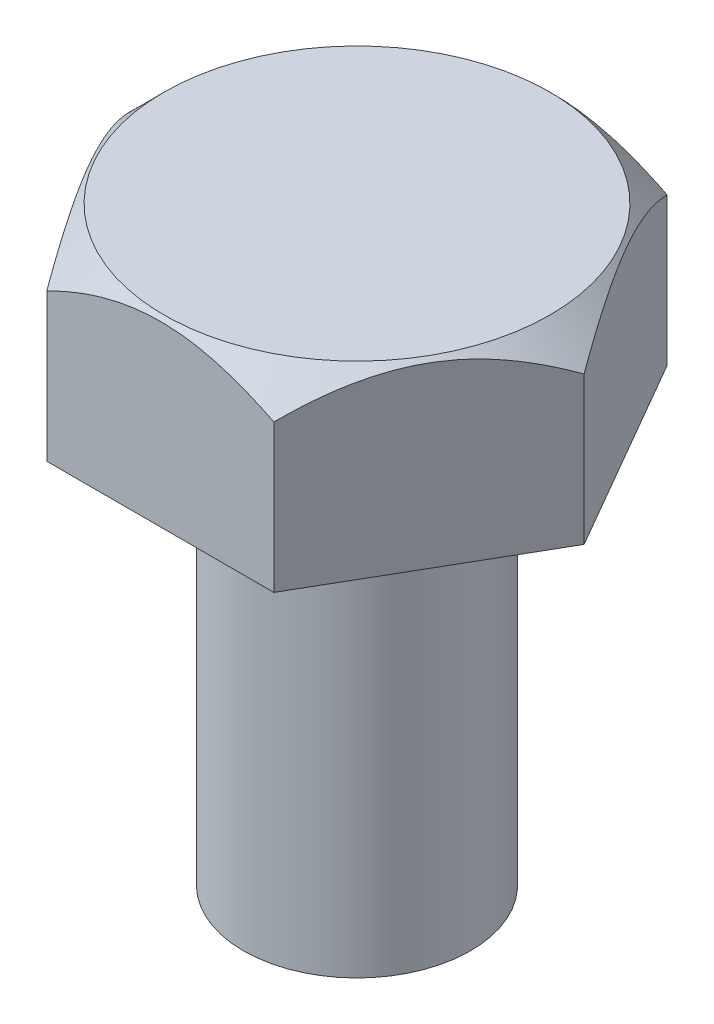
ISO-10303-21;
HEADER;
FILE_DESCRIPTION(('STEP AP214'),'2;1');
FILE_NAME('part.step','',(''),(''),'','','');
FILE_SCHEMA(('AUTOMOTIVE_DESIGN { 1 0 10303 214 1 1 1 1 }'));
ENDSEC;
DATA;
#1=APPLICATION_CONTEXT('core data for automotive mechanical design processes');
#2=APPLICATION_PROTOCOL_DEFINITION('international standard','automotive_design',2000,#1);
#3=PRODUCT_CONTEXT('',#1,'mechanical');
#4=PRODUCT('Part','Part','',(#3));
#5=PRODUCT_RELATED_PRODUCT_CATEGORY('part','',(#4));
#6=PRODUCT_DEFINITION_FORMATION('','',#4);
#7=PRODUCT_DEFINITION_CONTEXT('part definition',#1,'design');
#8=PRODUCT_DEFINITION('design','',#6,#7);
#9=PRODUCT_DEFINITION_SHAPE('','',#8);
#10=(LENGTH_UNIT() NAMED_UNIT(*) SI_UNIT(.MILLI.,.METRE.));
#11=(NAMED_UNIT(*) PLANE_ANGLE_UNIT() SI_UNIT($,.RADIAN.));
#12=(NAMED_UNIT(*) SI_UNIT($,.STERADIAN.) SOLID_ANGLE_UNIT());
#13=UNCERTAINTY_MEASURE_WITH_UNIT(LENGTH_MEASURE(1.E-05),#10,'distance_accuracy_value','');
#14=(GEOMETRIC_REPRESENTATION_CONTEXT(3) GLOBAL_UNCERTAINTY_ASSIGNED_CONTEXT((#13)) GLOBAL_UNIT_ASSIGNED_CONTEXT((#10,
#11,#12)) REPRESENTATION_CONTEXT('',''));
#15=CARTESIAN_POINT('',(0.,0.,0.));
#16=DIRECTION('',(0.,0.,1.));
#17=DIRECTION('',(1.,0.,0.));
#18=AXIS2_PLACEMENT_3D('',#15,#16,#17);
#19=CARTESIAN_POINT('',(2.5,13.,-4.3301270189222));
#20=DIRECTION('',(0.,0.,1.));
#21=DIRECTION('',(1.,0.,0.));
#22=AXIS2_PLACEMENT_3D('',#19,#20,#21);
#23=PLANE('',#22);
#24=CARTESIAN_POINT('',(7.55613710403917,8.54108457182886,-4.3301270189222));
#25=CARTESIAN_POINT('',(7.44442385375234,8.63800803765894,-4.3301270189222));
#26=CARTESIAN_POINT('',(7.33245031241012,8.73463152926766,-4.3301270189222));
#27=CARTESIAN_POINT('',(7.1079134679781,8.92719439782775,-4.3301270189222));
#28=CARTESIAN_POINT('',(6.99535015519964,9.02313376347894,-4.3301270189222));
#29=CARTESIAN_POINT('',(6.65657307409665,9.30988287604839,-4.3301270189222));
#30=CARTESIAN_POINT('',(6.42937519955911,9.49953397623941,-4.3301270189222));
#31=CARTESIAN_POINT('',(5.96641917398438,9.87910008337755,-4.3301270189222));
#32=CARTESIAN_POINT('',(5.73058414212983,10.0689216575157,-4.3301270189222));
#33=CARTESIAN_POINT('',(5.25447797257092,10.4428122014171,-4.3301270189222));
#34=CARTESIAN_POINT('',(5.01420796083656,10.6268826002054,-4.3301270189222));
#35=CARTESIAN_POINT('',(4.52742469483169,10.987359627444,-4.3301270189222));
#36=CARTESIAN_POINT('',(4.28090356507128,11.1637557418552,-4.3301270189222));
#37=CARTESIAN_POINT('',(3.90510568570069,11.419776357215,-4.3301270189222));
#38=CARTESIAN_POINT('',(3.77877625578397,11.5037250621307,-4.3301270189222));
#39=CARTESIAN_POINT('',(3.52383306383481,11.6680754835278,-4.3301270189222));
#40=CARTESIAN_POINT('',(3.39521945810706,11.748477441409,-4.3301270189222));
#41=CARTESIAN_POINT('',(3.13634691122589,11.9043405017029,-4.3301270189222));
#42=CARTESIAN_POINT('',(3.00610782019888,11.9798344246052,-4.3301270189222));
#43=CARTESIAN_POINT('',(2.7426654280334,12.1255326401843,-4.3301270189222));
#44=CARTESIAN_POINT('',(2.60946177222605,12.1957362954999,-4.3301270189222));
#45=CARTESIAN_POINT('',(2.33996788462026,12.3294527342879,-4.3301270189222));
#46=CARTESIAN_POINT('',(2.20368273424863,12.3929756777822,-4.3301270189222));
#47=CARTESIAN_POINT('',(1.92760063427982,12.5118431219212,-4.3301270189222));
#48=CARTESIAN_POINT('',(1.7878046504889,12.5671898435699,-4.3301270189222));
#49=CARTESIAN_POINT('',(1.5013427250049,12.6689836314487,-4.3301270189222));
#50=CARTESIAN_POINT('',(1.35459275930332,12.7151975656773,-4.3301270189222));
#51=CARTESIAN_POINT('',(1.05763707686497,12.7948718021725,-4.3301270189222));
#52=CARTESIAN_POINT('',(0.907431915588919,12.8283341394137,-4.3301270189222));
#53=CARTESIAN_POINT('',(0.605363911635064,12.8802751857401,-4.3301270189222));
#54=CARTESIAN_POINT('',(0.453517191144563,12.8988457992623,-4.3301270189222));
#55=CARTESIAN_POINT('',(0.148705099509723,12.9199865556138,-4.3301270189222));
#56=CARTESIAN_POINT('',(-0.00426014996809555,12.9225584135103,-4.3301270189222));
#57=CARTESIAN_POINT('',(-0.309804298060209,12.9114946441336,-4.3301270189222));
#58=CARTESIAN_POINT('',(-0.462382357616309,12.8978363540926,-4.3301270189222));
#59=CARTESIAN_POINT('',(-0.765388466326563,12.8553115731046,-4.3301270189222));
#60=CARTESIAN_POINT('',(-0.915816083942016,12.8264420724667,-4.3301270189222));
#61=CARTESIAN_POINT('',(-1.21449744723622,12.7551368632354,-4.3301270189222));
#62=CARTESIAN_POINT('',(-1.36272804972795,12.71260590677,-4.3301270189222));
#63=CARTESIAN_POINT('',(-1.65542682173331,12.6162840830005,-4.3301270189222));
#64=CARTESIAN_POINT('',(-1.79989494383901,12.5624930738948,-4.3301270189222));
#65=CARTESIAN_POINT('',(-2.11685166355881,12.4327685276804,-4.3301270189222));
#66=CARTESIAN_POINT('',(-2.28840620621059,12.3545720970596,-4.3301270189222));
#67=CARTESIAN_POINT('',(-2.62640951829005,12.1877467677618,-4.3301270189222));
#68=CARTESIAN_POINT('',(-2.79285527234585,12.0991118517479,-4.3301270189222));
#69=CARTESIAN_POINT('',(-3.1215810322957,11.9137266280605,-4.3301270189222));
#70=CARTESIAN_POINT('',(-3.28385171063057,11.8169599152732,-4.3301270189222));
#71=CARTESIAN_POINT('',(-3.60453109381586,11.6173355136561,-4.3301270189222));
#72=CARTESIAN_POINT('',(-3.76294055621275,11.5144790334023,-4.3301270189222));
#73=CARTESIAN_POINT('',(-4.07739049875764,11.3034496289185,-4.3301270189222));
#74=CARTESIAN_POINT('',(-4.23341381948707,11.1952512562934,-4.3301270189222));
#75=CARTESIAN_POINT('',(-4.54275851350861,10.9750609610228,-4.3301270189222));
#76=CARTESIAN_POINT('',(-4.69607978885857,10.8630689012943,-4.3301270189222));
#77=CARTESIAN_POINT('',(-5.00027774830968,10.6361869100533,-4.3301270189222));
#78=CARTESIAN_POINT('',(-5.15115708418207,10.5213005246004,-4.3301270189222));
#79=CARTESIAN_POINT('',(-5.45101327249505,10.2890677683981,-4.3301270189222));
#80=CARTESIAN_POINT('',(-5.59999006294959,10.1717213178256,-4.3301270189222));
#81=CARTESIAN_POINT('',(-6.05682937586901,9.8068491090875,-4.3301270189222));
#82=CARTESIAN_POINT('',(-6.36202304606487,9.55598022974198,-4.3301270189222));
#83=CARTESIAN_POINT('',(-6.81441430026593,9.17660574348785,-4.3301270189222));
#84=CARTESIAN_POINT('',(-6.96350708101545,9.05033754335616,-4.3301270189222));
#85=CARTESIAN_POINT('',(-7.26059570333492,8.79658165999703,-4.3301270189222));
#86=CARTESIAN_POINT('',(-7.40859177611269,8.66909424758113,-4.3301270189222));
#87=CARTESIAN_POINT('',(-7.55613710403917,8.54108457182886,-4.3301270189222));
#88=B_SPLINE_CURVE_WITH_KNOTS('',3,(#24,#25,#26,#27,#28,#29,#30,#31,#32,#33,#34,#35,#36,#37,#38,
#39,#40,#41,#42,#43,#44,#45,#46,#47,#48,#49,#50,#51,#52,#53,#54,#55,#56,#57,#58,#59,#60,#61,#62,
#63,#64,#65,#66,#67,#68,#69,#70,#71,#72,#73,#74,#75,#76,#77,#78,#79,#80,#81,#82,#83,#84,#85,#86,
#87),.UNSPECIFIED.,.F.,.F.,(4,2,2,2,2,2,2,2,2,2,2,2,2,2,2,2,2,2,2,2,2,2,2,2,2,2,2,2,2,2,2,4),
(0.,0.443695076528027,0.887397464991587,1.77521197053017,2.68335967769226,3.59127990845164,
4.50040718563498,4.95539858645767,5.41035897156353,5.86187217330992,6.31343968581671,
6.76431020988221,7.21505803254678,7.67614002227625,8.13714839899081,8.59528927593608,
9.05338103931505,9.51211320585825,9.97093617127222,10.4330301414026,10.8951299311859,
11.4602572306068,12.0257119110124,12.5923360642334,13.1588481396552,13.728384261203,
14.2979409846731,14.8668309223611,15.4357393477799,16.6208063736128,17.2069353085397,
17.7929369440817),.UNSPECIFIED.);
#89=CARTESIAN_POINT('',(2.5,12.25,-4.33012701892219));
#90=VERTEX_POINT('',#89);
#91=CARTESIAN_POINT('',(-2.5,12.25,-4.33012701892219));
#92=VERTEX_POINT('',#91);
#93=EDGE_CURVE('E97',#90,#92,#88,.T.);
#94=ORIENTED_EDGE('',*,*,#93,.F.);
#95=DIRECTION('',(0.,-1.,0.));
#96=VECTOR('',#95,1.);
#97=CARTESIAN_POINT('',(2.5,13.,-4.3301270189222));
#98=LINE('',#97,#96);
#99=CARTESIAN_POINT('',(2.5,9.,-4.3301270189222));
#100=VERTEX_POINT('',#99);
#101=EDGE_CURVE('E62',#90,#100,#98,.T.);
#102=ORIENTED_EDGE('',*,*,#101,.T.);
#103=DIRECTION('',(-1.,0.,0.));
#104=VECTOR('',#103,1.);
#105=CARTESIAN_POINT('',(2.5,9.,-4.3301270189222));
#106=LINE('',#105,#104);
#107=CARTESIAN_POINT('',(-2.5,9.,-4.3301270189222));
#108=VERTEX_POINT('',#107);
#109=EDGE_CURVE('E136',#100,#108,#106,.T.);
#110=ORIENTED_EDGE('',*,*,#109,.T.);
#111=DIRECTION('',(0.,-1.,0.));
#112=VECTOR('',#111,1.);
#113=CARTESIAN_POINT('',(-2.5,13.,-4.3301270189222));
#114=LINE('',#113,#112);
#115=EDGE_CURVE('E115',#92,#108,#114,.T.);
#116=ORIENTED_EDGE('',*,*,#115,.F.);
#117=EDGE_LOOP('',(#94,#102,#110,#116));
#118=FACE_BOUND('',#117,.T.);
#119=ADVANCED_FACE('F39',(#118),#23,.F.);
#120=CARTESIAN_POINT('',(-2.5,13.,-4.3301270189222));
#121=DIRECTION('',(0.866025403784439,0.,0.5));
#122=DIRECTION('',(0.5,0.,-0.866025403784439));
#123=AXIS2_PLACEMENT_3D('',#120,#121,#122);
#124=PLANE('',#123);
#125=CARTESIAN_POINT('',(-2.49988452994616,12.2498845259463,-4.33032701892219));
#126=CARTESIAN_POINT('',(-2.54287138041576,12.2928679014172,-4.25587160985149));
#127=CARTESIAN_POINT('',(-2.58618865330985,12.3345322160249,-4.18084389235359));
#128=CARTESIAN_POINT('',(-2.67354887274435,12.4148214570814,-4.02953155373268));
#129=CARTESIAN_POINT('',(-2.71759219997896,12.4534447234691,-3.95324627322796));
#130=CARTESIAN_POINT('',(-2.85131771209198,12.5644804420678,-3.72162689198003));
#131=CARTESIAN_POINT('',(-2.94213197757914,12.6315850955109,-3.56433197010422));
#132=CARTESIAN_POINT('',(-3.12526622915858,12.7464973477853,-3.24713414176253));
#133=CARTESIAN_POINT('',(-3.21753940303059,12.7945944631137,-3.08731231644057));
#134=CARTESIAN_POINT('',(-3.35746623690526,12.8502311247179,-2.8449519308274));
#135=CARTESIAN_POINT('',(-3.40431453249364,12.866017735568,-2.76380830262032));
#136=CARTESIAN_POINT('',(-3.4984078137364,12.8917307019677,-2.60083395885699));
#137=CARTESIAN_POINT('',(-3.54565273902892,12.9016579334098,-2.51900334785054));
#138=CARTESIAN_POINT('',(-3.66078037944806,12.9183021731439,-2.31959642528907));
#139=CARTESIAN_POINT('',(-3.72878713668329,12.9217946588034,-2.20180526649966));
#140=CARTESIAN_POINT('',(-3.86467809794897,12.9159341038672,-1.96643521729813));
#141=CARTESIAN_POINT('',(-3.93256225066694,12.9065765602643,-1.84885641576183));
#142=CARTESIAN_POINT('',(-4.06769057590285,12.8755675384182,-1.61480729091154));
#143=CARTESIAN_POINT('',(-4.13493394699394,12.8539023105296,-1.49833835570958));
#144=CARTESIAN_POINT('',(-4.26826494691756,12.7994557859257,-1.26740228961789));
#145=CARTESIAN_POINT('',(-4.33435266395686,12.766675341522,-1.1529350059496));
#146=CARTESIAN_POINT('',(-4.45167355371377,12.6992338613143,-0.949729264101437));
#147=CARTESIAN_POINT('',(-4.50316644513569,12.6663460937711,-0.860540959930034));
#148=CARTESIAN_POINT('',(-4.60522781060437,12.5952704801556,-0.683765489448427));
#149=CARTESIAN_POINT('',(-4.65579625649568,12.5570824729595,-0.596178371904881));
#150=CARTESIAN_POINT('',(-4.75584946376349,12.476262498628,-0.422881133456826));
#151=CARTESIAN_POINT('',(-4.80533707077893,12.4336445061233,-0.337166083761073));
#152=CARTESIAN_POINT('',(-4.90339584958638,12.3445241637333,-0.167323296738408));
#153=CARTESIAN_POINT('',(-4.95196756146993,12.298024196775,-0.0831946239455084));
#154=CARTESIAN_POINT('',(-5.00011547005384,12.2498845259463,0.000199999999999748));
#155=B_SPLINE_CURVE_WITH_KNOTS('',3,(#125,#126,#127,#128,#129,#130,#131,#132,#133,#134,#135,
#136,#137,#138,#139,#140,#141,#142,#143,#144,#145,#146,#147,#148,#149,#150,#151,#152,#153,#154),
.UNSPECIFIED.,.F.,.F.,(4,2,2,2,2,2,2,2,2,2,2,2,2,2,4),(0.,0.288343025050063,0.576842376266668,
1.15695604992332,1.72785747296512,2.01274823950903,2.29759640821263,2.70513724110404,
3.11282092407139,3.52096095288678,3.92906969271704,4.25324617843569,4.57743252106523,
4.90062556888121,5.22362166510138),.UNSPECIFIED.);
#156=CARTESIAN_POINT('',(-5.,12.25,0.));
#157=VERTEX_POINT('',#156);
#158=EDGE_CURVE('E92',#92,#157,#155,.T.);
#159=ORIENTED_EDGE('',*,*,#158,.F.);
#160=ORIENTED_EDGE('',*,*,#115,.T.);
#161=DIRECTION('',(-0.5,0.,0.866025403784439));
#162=VECTOR('',#161,1.);
#163=CARTESIAN_POINT('',(-2.5,9.,-4.3301270189222));
#164=LINE('',#163,#162);
#165=CARTESIAN_POINT('',(-5.,9.,0.));
#166=VERTEX_POINT('',#165);
#167=EDGE_CURVE('E113',#108,#166,#164,.T.);
#168=ORIENTED_EDGE('',*,*,#167,.T.);
#169=DIRECTION('',(0.,-1.,0.));
#170=VECTOR('',#169,1.);
#171=CARTESIAN_POINT('',(-5.,13.,0.));
#172=LINE('',#171,#170);
#173=EDGE_CURVE('E106',#157,#166,#172,.T.);
#174=ORIENTED_EDGE('',*,*,#173,.F.);
#175=EDGE_LOOP('',(#159,#160,#168,#174));
#176=FACE_BOUND('',#175,.T.);
#177=ADVANCED_FACE('F111',(#176),#124,.F.);
#178=CARTESIAN_POINT('',(-5.,13.,0.));
#179=DIRECTION('',(0.866025403784439,0.,-0.5));
#180=DIRECTION('',(-0.5,0.,-0.866025403784439));
#181=AXIS2_PLACEMENT_3D('',#178,#179,#180);
#182=PLANE('',#181);
#183=CARTESIAN_POINT('',(-5.00011547005384,12.2498845259463,-0.00020000000000025));
#184=CARTESIAN_POINT('',(-4.95712861958424,12.2928679014172,0.0742554090707057));
#185=CARTESIAN_POINT('',(-4.91381134669015,12.3345322160249,0.149283126568603));
#186=CARTESIAN_POINT('',(-4.82645112725565,12.4148214570814,0.300595465189512));
#187=CARTESIAN_POINT('',(-4.78240780002105,12.4534447234691,0.376880745694239));
#188=CARTESIAN_POINT('',(-4.64868228790802,12.5644804420678,0.608500126942163));
#189=CARTESIAN_POINT('',(-4.55786802242086,12.6315850955109,0.765795048817974));
#190=CARTESIAN_POINT('',(-4.37473377084142,12.7464973477853,1.08299287715967));
#191=CARTESIAN_POINT('',(-4.28246059696941,12.7945944631137,1.24281470248163));
#192=CARTESIAN_POINT('',(-4.14253376309474,12.8502311247179,1.48517508809479));
#193=CARTESIAN_POINT('',(-4.09568546750636,12.866017735568,1.56631871630188));
#194=CARTESIAN_POINT('',(-4.0015921862636,12.8917307019677,1.72929306006521));
#195=CARTESIAN_POINT('',(-3.95434726097108,12.9016579334098,1.81112367107166));
#196=CARTESIAN_POINT('',(-3.83921962055194,12.9183021731439,2.01053059363312));
#197=CARTESIAN_POINT('',(-3.77121286331671,12.9217946588034,2.12832175242254));
#198=CARTESIAN_POINT('',(-3.63532190205103,12.9159341038672,2.36369180162407));
#199=CARTESIAN_POINT('',(-3.56743774933306,12.9065765602643,2.48127060316037));
#200=CARTESIAN_POINT('',(-3.43230942409715,12.8755675384182,2.71531972801065));
#201=CARTESIAN_POINT('',(-3.36506605300606,12.8539023105296,2.83178866321262));
#202=CARTESIAN_POINT('',(-3.23173505308244,12.7994557859257,3.0627247293043));
#203=CARTESIAN_POINT('',(-3.16564733604314,12.766675341522,3.1771920129726));
#204=CARTESIAN_POINT('',(-3.04832644628623,12.6992338613143,3.38039775482076));
#205=CARTESIAN_POINT('',(-2.9968335548643,12.6663460937711,3.46958605899216));
#206=CARTESIAN_POINT('',(-2.89477218939563,12.5952704801556,3.64636152947377));
#207=CARTESIAN_POINT('',(-2.84420374350432,12.5570824729595,3.73394864701731));
#208=CARTESIAN_POINT('',(-2.74415053623651,12.476262498628,3.90724588546537));
#209=CARTESIAN_POINT('',(-2.69466292922107,12.4336445061233,3.99296093516112));
#210=CARTESIAN_POINT('',(-2.59660415041362,12.3445241637333,4.16280372218378));
#211=CARTESIAN_POINT('',(-2.54803243853007,12.298024196775,4.24693239497668));
#212=CARTESIAN_POINT('',(-2.49988452994616,12.2498845259463,4.33032701892219));
#213=B_SPLINE_CURVE_WITH_KNOTS('',3,(#183,#184,#185,#186,#187,#188,#189,#190,#191,#192,#193,
#194,#195,#196,#197,#198,#199,#200,#201,#202,#203,#204,#205,#206,#207,#208,#209,#210,#211,#212),
.UNSPECIFIED.,.F.,.F.,(4,2,2,2,2,2,2,2,2,2,2,2,2,2,4),(0.,0.288343025050063,0.576842376266669,
1.15695604992332,1.72785747296512,2.01274823950903,2.29759640821263,2.70513724110404,
3.11282092407139,3.52096095288677,3.92906969271704,4.25324617843569,4.57743252106522,
4.90062556888121,5.22362166510138),.UNSPECIFIED.);
#214=CARTESIAN_POINT('',(-2.5,12.25,4.33012701892219));
#215=VERTEX_POINT('',#214);
#216=EDGE_CURVE('E95',#157,#215,#213,.T.);
#217=ORIENTED_EDGE('',*,*,#216,.F.);
#218=ORIENTED_EDGE('',*,*,#173,.T.);
#219=DIRECTION('',(0.5,0.,0.866025403784439));
#220=VECTOR('',#219,1.);
#221=CARTESIAN_POINT('',(-5.,9.,0.));
#222=LINE('',#221,#220);
#223=CARTESIAN_POINT('',(-2.5,9.,4.33012701892219));
#224=VERTEX_POINT('',#223);
#225=EDGE_CURVE('E133',#166,#224,#222,.T.);
#226=ORIENTED_EDGE('',*,*,#225,.T.);
#227=DIRECTION('',(0.,-1.,0.));
#228=VECTOR('',#227,1.);
#229=CARTESIAN_POINT('',(-2.5,13.,4.33012701892219));
#230=LINE('',#229,#228);
#231=EDGE_CURVE('E108',#215,#224,#230,.T.);
#232=ORIENTED_EDGE('',*,*,#231,.F.);
#233=EDGE_LOOP('',(#217,#218,#226,#232));
#234=FACE_BOUND('',#233,.T.);
#235=ADVANCED_FACE('F104',(#234),#182,.F.);
#236=CARTESIAN_POINT('',(-2.5,13.,4.33012701892219));
#237=DIRECTION('',(0.,0.,-1.));
#238=DIRECTION('',(-1.,0.,0.));
#239=AXIS2_PLACEMENT_3D('',#236,#237,#238);
#240=PLANE('',#239);
#241=CARTESIAN_POINT('',(-7.55613710403917,8.54108457182886,4.33012701892219));
#242=CARTESIAN_POINT('',(-7.44442385375235,8.63800803765894,4.33012701892219));
#243=CARTESIAN_POINT('',(-7.33245031241013,8.73463152926766,4.33012701892219));
#244=CARTESIAN_POINT('',(-7.1079134679781,8.92719439782775,4.33012701892219));
#245=CARTESIAN_POINT('',(-6.99535015519964,9.02313376347894,4.33012701892219));
#246=CARTESIAN_POINT('',(-6.65657307409665,9.30988287604839,4.33012701892219));
#247=CARTESIAN_POINT('',(-6.42937519955911,9.49953397623941,4.33012701892219));
#248=CARTESIAN_POINT('',(-5.96641917398438,9.87910008337755,4.33012701892219));
#249=CARTESIAN_POINT('',(-5.73058414212984,10.0689216575157,4.33012701892219));
#250=CARTESIAN_POINT('',(-5.25447797257092,10.4428122014171,4.33012701892219));
#251=CARTESIAN_POINT('',(-5.01420796083657,10.6268826002054,4.33012701892219));
#252=CARTESIAN_POINT('',(-4.5274246948317,10.987359627444,4.33012701892219));
#253=CARTESIAN_POINT('',(-4.28090356507128,11.1637557418552,4.33012701892219));
#254=CARTESIAN_POINT('',(-3.9051056857007,11.419776357215,4.33012701892219));
#255=CARTESIAN_POINT('',(-3.77877625578398,11.5037250621307,4.33012701892219));
#256=CARTESIAN_POINT('',(-3.52383306383481,11.6680754835278,4.33012701892219));
#257=CARTESIAN_POINT('',(-3.39521945810706,11.748477441409,4.33012701892219));
#258=CARTESIAN_POINT('',(-3.13634691122589,11.9043405017029,4.33012701892219));
#259=CARTESIAN_POINT('',(-3.00610782019888,11.9798344246052,4.33012701892219));
#260=CARTESIAN_POINT('',(-2.7426654280334,12.1255326401843,4.33012701892219));
#261=CARTESIAN_POINT('',(-2.60946177222606,12.1957362954999,4.33012701892219));
#262=CARTESIAN_POINT('',(-2.33996788462027,12.3294527342879,4.33012701892219));
#263=CARTESIAN_POINT('',(-2.20368273424863,12.3929756777822,4.33012701892219));
#264=CARTESIAN_POINT('',(-1.92760063427983,12.5118431219212,4.33012701892219));
#265=CARTESIAN_POINT('',(-1.7878046504889,12.5671898435699,4.33012701892219));
#266=CARTESIAN_POINT('',(-1.5013427250049,12.6689836314487,4.33012701892219));
#267=CARTESIAN_POINT('',(-1.35459275930333,12.7151975656773,4.33012701892219));
#268=CARTESIAN_POINT('',(-1.05763707686498,12.7948718021725,4.33012701892219));
#269=CARTESIAN_POINT('',(-0.907431915588923,12.8283341394137,4.33012701892219));
#270=CARTESIAN_POINT('',(-0.605363911635067,12.8802751857401,4.33012701892219));
#271=CARTESIAN_POINT('',(-0.453517191144565,12.8988457992623,4.33012701892219));
#272=CARTESIAN_POINT('',(-0.148705099509726,12.9199865556138,4.33012701892219));
#273=CARTESIAN_POINT('',(0.00426014996809243,12.9225584135103,4.33012701892219));
#274=CARTESIAN_POINT('',(0.309804298060206,12.9114946441337,4.33012701892219));
#275=CARTESIAN_POINT('',(0.462382357616307,12.8978363540926,4.33012701892219));
#276=CARTESIAN_POINT('',(0.765388466326561,12.8553115731046,4.33012701892219));
#277=CARTESIAN_POINT('',(0.915816083942013,12.8264420724667,4.33012701892219));
#278=CARTESIAN_POINT('',(1.21449744723622,12.7551368632354,4.33012701892219));
#279=CARTESIAN_POINT('',(1.36272804972795,12.71260590677,4.33012701892219));
#280=CARTESIAN_POINT('',(1.65542682173331,12.6162840830005,4.33012701892219));
#281=CARTESIAN_POINT('',(1.79989494383901,12.5624930738948,4.33012701892219));
#282=CARTESIAN_POINT('',(2.11685166355881,12.4327685276804,4.33012701892219));
#283=CARTESIAN_POINT('',(2.28840620621059,12.3545720970596,4.33012701892219));
#284=CARTESIAN_POINT('',(2.62640951829005,12.1877467677618,4.33012701892219));
#285=CARTESIAN_POINT('',(2.79285527234585,12.0991118517479,4.33012701892219));
#286=CARTESIAN_POINT('',(3.1215810322957,11.9137266280605,4.33012701892219));
#287=CARTESIAN_POINT('',(3.28385171063057,11.8169599152732,4.33012701892219));
#288=CARTESIAN_POINT('',(3.60453109381586,11.6173355136561,4.33012701892219));
#289=CARTESIAN_POINT('',(3.76294055621275,11.5144790334023,4.33012701892219));
#290=CARTESIAN_POINT('',(4.07739049875764,11.3034496289185,4.33012701892219));
#291=CARTESIAN_POINT('',(4.23341381948707,11.1952512562934,4.33012701892219));
#292=CARTESIAN_POINT('',(4.54275851350861,10.9750609610228,4.33012701892219));
#293=CARTESIAN_POINT('',(4.69607978885857,10.8630689012943,4.33012701892219));
#294=CARTESIAN_POINT('',(5.00027774830968,10.6361869100533,4.33012701892219));
#295=CARTESIAN_POINT('',(5.15115708418206,10.5213005246004,4.33012701892219));
#296=CARTESIAN_POINT('',(5.45101327249505,10.2890677683981,4.33012701892219));
#297=CARTESIAN_POINT('',(5.59999006294959,10.1717213178256,4.33012701892219));
#298=CARTESIAN_POINT('',(6.05682937586901,9.8068491090875,4.33012701892219));
#299=CARTESIAN_POINT('',(6.36202304606487,9.55598022974198,4.33012701892219));
#300=CARTESIAN_POINT('',(6.81441430026593,9.17660574348785,4.33012701892219));
#301=CARTESIAN_POINT('',(6.96350708101545,9.05033754335616,4.33012701892219));
#302=CARTESIAN_POINT('',(7.26059570333492,8.79658165999703,4.33012701892219));
#303=CARTESIAN_POINT('',(7.40859177611269,8.66909424758113,4.33012701892219));
#304=CARTESIAN_POINT('',(7.55613710403917,8.54108457182885,4.33012701892219));
#305=B_SPLINE_CURVE_WITH_KNOTS('',3,(#241,#242,#243,#244,#245,#246,#247,#248,#249,#250,#251,
#252,#253,#254,#255,#256,#257,#258,#259,#260,#261,#262,#263,#264,#265,#266,#267,#268,#269,#270,
#271,#272,#273,#274,#275,#276,#277,#278,#279,#280,#281,#282,#283,#284,#285,#286,#287,#288,#289,
#290,#291,#292,#293,#294,#295,#296,#297,#298,#299,#300,#301,#302,#303,#304),.UNSPECIFIED.,.F.,
.F.,(4,2,2,2,2,2,2,2,2,2,2,2,2,2,2,2,2,2,2,2,2,2,2,2,2,2,2,2,2,2,2,4),(0.,0.443695076528027,
0.887397464991587,1.77521197053017,2.68335967769226,3.59127990845164,4.50040718563498,
4.95539858645767,5.41035897156353,5.86187217330992,6.31343968581672,6.76431020988221,
7.21505803254678,7.67614002227625,8.13714839899081,8.59528927593608,9.05338103931505,
9.51211320585825,9.97093617127222,10.4330301414026,10.8951299311859,11.4602572306068,
12.0257119110124,12.5923360642334,13.1588481396552,13.728384261203,14.2979409846731,
14.8668309223611,15.4357393477799,16.6208063736128,17.2069353085397,17.7929369440817),.UNSPECIFIED.);
#306=CARTESIAN_POINT('',(2.5,12.25,4.33012701892219));
#307=VERTEX_POINT('',#306);
#308=EDGE_CURVE('E109',#215,#307,#305,.T.);
#309=ORIENTED_EDGE('',*,*,#308,.F.);
#310=ORIENTED_EDGE('',*,*,#231,.T.);
#311=DIRECTION('',(1.,0.,0.));
#312=VECTOR('',#311,1.);
#313=CARTESIAN_POINT('',(-2.5,9.,4.33012701892219));
#314=LINE('',#313,#312);
#315=CARTESIAN_POINT('',(2.5,9.,4.33012701892219));
#316=VERTEX_POINT('',#315);
#317=EDGE_CURVE('E130',#224,#316,#314,.T.);
#318=ORIENTED_EDGE('',*,*,#317,.T.);
#319=DIRECTION('',(0.,-1.,0.));
#320=VECTOR('',#319,1.);
#321=CARTESIAN_POINT('',(2.5,13.,4.33012701892219));
#322=LINE('',#321,#320);
#323=EDGE_CURVE('E118',#307,#316,#322,.T.);
#324=ORIENTED_EDGE('',*,*,#323,.F.);
#325=EDGE_LOOP('',(#309,#310,#318,#324));
#326=FACE_BOUND('',#325,.T.);
#327=ADVANCED_FACE('F189',(#326),#240,.F.);
#328=CARTESIAN_POINT('',(2.5,13.,4.33012701892219));
#329=DIRECTION('',(-0.866025403784439,0.,-0.5));
#330=DIRECTION('',(-0.5,0.,0.866025403784439));
#331=AXIS2_PLACEMENT_3D('',#328,#329,#330);
#332=PLANE('',#331);
#333=CARTESIAN_POINT('',(2.49988452994616,12.2498845259463,4.33032701892219));
#334=CARTESIAN_POINT('',(2.54287138041576,12.2928679014172,4.25587160985149));
#335=CARTESIAN_POINT('',(2.58618865330985,12.3345322160249,4.18084389235359));
#336=CARTESIAN_POINT('',(2.67354887274435,12.4148214570814,4.02953155373268));
#337=CARTESIAN_POINT('',(2.71759219997896,12.4534447234691,3.95324627322795));
#338=CARTESIAN_POINT('',(2.85131771209198,12.5644804420678,3.72162689198003));
#339=CARTESIAN_POINT('',(2.94213197757914,12.6315850955109,3.56433197010422));
#340=CARTESIAN_POINT('',(3.12526622915858,12.7464973477853,3.24713414176253));
#341=CARTESIAN_POINT('',(3.21753940303059,12.7945944631137,3.08731231644057));
#342=CARTESIAN_POINT('',(3.35746623690525,12.8502311247179,2.8449519308274));
#343=CARTESIAN_POINT('',(3.40431453249364,12.866017735568,2.76380830262032));
#344=CARTESIAN_POINT('',(3.4984078137364,12.8917307019677,2.60083395885699));
#345=CARTESIAN_POINT('',(3.54565273902892,12.9016579334098,2.51900334785054));
#346=CARTESIAN_POINT('',(3.66078037944806,12.9183021731439,2.31959642528907));
#347=CARTESIAN_POINT('',(3.72878713668329,12.9217946588034,2.20180526649966));
#348=CARTESIAN_POINT('',(3.86467809794896,12.9159341038672,1.96643521729813));
#349=CARTESIAN_POINT('',(3.93256225066694,12.9065765602643,1.84885641576183));
#350=CARTESIAN_POINT('',(4.06769057590285,12.8755675384182,1.61480729091154));
#351=CARTESIAN_POINT('',(4.13493394699393,12.8539023105296,1.49833835570958));
#352=CARTESIAN_POINT('',(4.26826494691756,12.7994557859257,1.26740228961789));
#353=CARTESIAN_POINT('',(4.33435266395686,12.766675341522,1.1529350059496));
#354=CARTESIAN_POINT('',(4.45167355371377,12.6992338613143,0.94972926410144));
#355=CARTESIAN_POINT('',(4.50316644513569,12.6663460937711,0.860540959930036));
#356=CARTESIAN_POINT('',(4.60522781060437,12.5952704801556,0.683765489448429));
#357=CARTESIAN_POINT('',(4.65579625649568,12.5570824729595,0.596178371904883));
#358=CARTESIAN_POINT('',(4.75584946376349,12.476262498628,0.422881133456828));
#359=CARTESIAN_POINT('',(4.80533707077893,12.4336445061233,0.337166083761076));
#360=CARTESIAN_POINT('',(4.90339584958638,12.3445241637333,0.167323296738411));
#361=CARTESIAN_POINT('',(4.95196756146993,12.298024196775,0.0831946239455096));
#362=CARTESIAN_POINT('',(5.00011547005384,12.2498845259463,-0.000199999999999203));
#363=B_SPLINE_CURVE_WITH_KNOTS('',3,(#333,#334,#335,#336,#337,#338,#339,#340,#341,#342,#343,
#344,#345,#346,#347,#348,#349,#350,#351,#352,#353,#354,#355,#356,#357,#358,#359,#360,#361,#362),
.UNSPECIFIED.,.F.,.F.,(4,2,2,2,2,2,2,2,2,2,2,2,2,2,4),(0.,0.288343025050061,0.576842376266667,
1.15695604992332,1.72785747296512,2.01274823950902,2.29759640821263,2.70513724110403,
3.11282092407139,3.52096095288677,3.92906969271704,4.25324617843569,4.57743252106522,
4.90062556888121,5.22362166510138),.UNSPECIFIED.);
#364=CARTESIAN_POINT('',(5.,12.25,0.));
#365=VERTEX_POINT('',#364);
#366=EDGE_CURVE('E54',#307,#365,#363,.T.);
#367=ORIENTED_EDGE('',*,*,#366,.F.);
#368=ORIENTED_EDGE('',*,*,#323,.T.);
#369=DIRECTION('',(0.5,0.,-0.866025403784439));
#370=VECTOR('',#369,1.);
#371=CARTESIAN_POINT('',(2.5,9.,4.33012701892219));
#372=LINE('',#371,#370);
#373=CARTESIAN_POINT('',(5.,9.,0.));
#374=VERTEX_POINT('',#373);
#375=EDGE_CURVE('E127',#316,#374,#372,.T.);
#376=ORIENTED_EDGE('',*,*,#375,.T.);
#377=DIRECTION('',(0.,-1.,0.));
#378=VECTOR('',#377,1.);
#379=CARTESIAN_POINT('',(5.,13.,0.));
#380=LINE('',#379,#378);
#381=EDGE_CURVE('E122',#365,#374,#380,.T.);
#382=ORIENTED_EDGE('',*,*,#381,.F.);
#383=EDGE_LOOP('',(#367,#368,#376,#382));
#384=FACE_BOUND('',#383,.T.);
#385=ADVANCED_FACE('F244',(#384),#332,.F.);
#386=CARTESIAN_POINT('',(5.,13.,0.));
#387=DIRECTION('',(-0.866025403784439,0.,0.5));
#388=DIRECTION('',(0.5,0.,0.866025403784439));
#389=AXIS2_PLACEMENT_3D('',#386,#387,#388);
#390=PLANE('',#389);
#391=CARTESIAN_POINT('',(5.00011547005384,12.2498845259463,0.000200000000000612));
#392=CARTESIAN_POINT('',(4.95712861958424,12.2928679014172,-0.074255409070705));
#393=CARTESIAN_POINT('',(4.91381134669015,12.3345322160249,-0.149283126568602));
#394=CARTESIAN_POINT('',(4.82645112725566,12.4148214570814,-0.300595465189511));
#395=CARTESIAN_POINT('',(4.78240780002105,12.4534447234691,-0.376880745694238));
#396=CARTESIAN_POINT('',(4.64868228790802,12.5644804420678,-0.608500126942162));
#397=CARTESIAN_POINT('',(4.55786802242086,12.6315850955109,-0.765795048817974));
#398=CARTESIAN_POINT('',(4.37473377084142,12.7464973477853,-1.08299287715967));
#399=CARTESIAN_POINT('',(4.28246059696941,12.7945944631137,-1.24281470248163));
#400=CARTESIAN_POINT('',(4.14253376309475,12.8502311247179,-1.48517508809479));
#401=CARTESIAN_POINT('',(4.09568546750636,12.866017735568,-1.56631871630187));
#402=CARTESIAN_POINT('',(4.0015921862636,12.8917307019677,-1.7292930600652));
#403=CARTESIAN_POINT('',(3.95434726097108,12.9016579334098,-1.81112367107166));
#404=CARTESIAN_POINT('',(3.83921962055194,12.9183021731439,-2.01053059363312));
#405=CARTESIAN_POINT('',(3.77121286331671,12.9217946588034,-2.12832175242254));
#406=CARTESIAN_POINT('',(3.63532190205103,12.9159341038672,-2.36369180162407));
#407=CARTESIAN_POINT('',(3.56743774933306,12.9065765602643,-2.48127060316037));
#408=CARTESIAN_POINT('',(3.43230942409715,12.8755675384182,-2.71531972801065));
#409=CARTESIAN_POINT('',(3.36506605300606,12.8539023105296,-2.83178866321262));
#410=CARTESIAN_POINT('',(3.23173505308244,12.7994557859257,-3.0627247293043));
#411=CARTESIAN_POINT('',(3.16564733604314,12.766675341522,-3.1771920129726));
#412=CARTESIAN_POINT('',(3.04832644628623,12.6992338613143,-3.38039775482076));
#413=CARTESIAN_POINT('',(2.9968335548643,12.6663460937711,-3.46958605899216));
#414=CARTESIAN_POINT('',(2.89477218939563,12.5952704801556,-3.64636152947377));
#415=CARTESIAN_POINT('',(2.84420374350432,12.5570824729595,-3.73394864701731));
#416=CARTESIAN_POINT('',(2.74415053623651,12.476262498628,-3.90724588546537));
#417=CARTESIAN_POINT('',(2.69466292922107,12.4336445061233,-3.99296093516112));
#418=CARTESIAN_POINT('',(2.59660415041362,12.3445241637333,-4.16280372218379));
#419=CARTESIAN_POINT('',(2.54803243853007,12.298024196775,-4.24693239497669));
#420=CARTESIAN_POINT('',(2.49988452994616,12.2498845259463,-4.3303270189222));
#421=B_SPLINE_CURVE_WITH_KNOTS('',3,(#391,#392,#393,#394,#395,#396,#397,#398,#399,#400,#401,
#402,#403,#404,#405,#406,#407,#408,#409,#410,#411,#412,#413,#414,#415,#416,#417,#418,#419,#420),
.UNSPECIFIED.,.F.,.F.,(4,2,2,2,2,2,2,2,2,2,2,2,2,2,4),(0.,0.288343025050061,0.576842376266668,
1.15695604992332,1.72785747296512,2.01274823950903,2.29759640821263,2.70513724110404,
3.11282092407139,3.52096095288677,3.92906969271704,4.25324617843569,4.57743252106523,
4.90062556888121,5.22362166510138),.UNSPECIFIED.);
#422=EDGE_CURVE('E160',#365,#90,#421,.T.);
#423=ORIENTED_EDGE('',*,*,#422,.F.);
#424=ORIENTED_EDGE('',*,*,#381,.T.);
#425=DIRECTION('',(-0.5,0.,-0.866025403784439));
#426=VECTOR('',#425,1.);
#427=CARTESIAN_POINT('',(5.,9.,0.));
#428=LINE('',#427,#426);
#429=EDGE_CURVE('E125',#374,#100,#428,.T.);
#430=ORIENTED_EDGE('',*,*,#429,.T.);
#431=ORIENTED_EDGE('',*,*,#101,.F.);
#432=EDGE_LOOP('',(#423,#424,#430,#431));
#433=FACE_BOUND('',#432,.T.);
#434=ADVANCED_FACE('F199',(#433),#390,.F.);
#435=CARTESIAN_POINT('',(0.,9.,0.));
#436=DIRECTION('',(0.,-1.,0.));
#437=DIRECTION('',(0.,0.,-1.));
#438=AXIS2_PLACEMENT_3D('',#435,#436,#437);
#439=CYLINDRICAL_SURFACE('',#438,2.5);
#440=CARTESIAN_POINT('',(0.,9.,0.));
#441=DIRECTION('',(0.,1.,0.));
#442=DIRECTION('',(0.,0.,1.));
#443=AXIS2_PLACEMENT_3D('',#440,#441,#442);
#444=CIRCLE('',#443,2.5);
#445=CARTESIAN_POINT('',(0.,9.,2.5));
#446=VERTEX_POINT('',#445);
#447=EDGE_CURVE('E12',#446,#446,#444,.T.);
#448=ORIENTED_EDGE('',*,*,#447,.F.);
#449=EDGE_LOOP('',(#448));
#450=FACE_BOUND('',#449,.T.);
#451=CARTESIAN_POINT('',(0.,0.,0.));
#452=DIRECTION('',(0.,1.,0.));
#453=DIRECTION('',(0.,0.,1.));
#454=AXIS2_PLACEMENT_3D('',#451,#452,#453);
#455=CIRCLE('',#454,2.5);
#456=CARTESIAN_POINT('',(0.,0.,2.5));
#457=VERTEX_POINT('',#456);
#458=EDGE_CURVE('E43',#457,#457,#455,.T.);
#459=ORIENTED_EDGE('',*,*,#458,.T.);
#460=EDGE_LOOP('',(#459));
#461=FACE_BOUND('',#460,.T.);
#462=ADVANCED_FACE('F41',(#450,#461),#439,.T.);
#463=CARTESIAN_POINT('',(0.,0.,0.));
#464=DIRECTION('',(0.,1.,0.));
#465=DIRECTION('',(0.,0.,1.));
#466=AXIS2_PLACEMENT_3D('',#463,#464,#465);
#467=PLANE('',#466);
#468=ORIENTED_EDGE('',*,*,#458,.F.);
#469=EDGE_LOOP('',(#468));
#470=FACE_BOUND('',#469,.T.);
#471=ADVANCED_FACE('F226',(#470),#467,.F.);
#472=CARTESIAN_POINT('',(0.,9.,0.));
#473=DIRECTION('',(0.,1.,0.));
#474=DIRECTION('',(0.,0.,1.));
#475=AXIS2_PLACEMENT_3D('',#472,#473,#474);
#476=PLANE('',#475);
#477=ORIENTED_EDGE('',*,*,#447,.T.);
#478=EDGE_LOOP('',(#477));
#479=FACE_BOUND('',#478,.T.);
#480=ORIENTED_EDGE('',*,*,#109,.F.);
#481=ORIENTED_EDGE('',*,*,#429,.F.);
#482=ORIENTED_EDGE('',*,*,#375,.F.);
#483=ORIENTED_EDGE('',*,*,#317,.F.);
#484=ORIENTED_EDGE('',*,*,#225,.F.);
#485=ORIENTED_EDGE('',*,*,#167,.F.);
#486=EDGE_LOOP('',(#480,#481,#482,#483,#484,#485));
#487=FACE_BOUND('',#486,.T.);
#488=ADVANCED_FACE('F154',(#479,#487),#476,.F.);
#489=CARTESIAN_POINT('',(0.,13.,0.));
#490=DIRECTION('',(0.,-1.,0.));
#491=DIRECTION('',(1.,0.,0.));
#492=AXIS2_PLACEMENT_3D('',#489,#490,#491);
#493=CONICAL_SURFACE('',#492,4.25,0.785398163397449);
#494=CARTESIAN_POINT('',(0.,13.,0.));
#495=DIRECTION('',(0.,1.,0.));
#496=DIRECTION('',(-1.,0.,0.));
#497=AXIS2_PLACEMENT_3D('',#494,#495,#496);
#498=CIRCLE('',#497,4.25);
#499=CARTESIAN_POINT('',(-4.25,13.,0.));
#500=VERTEX_POINT('',#499);
#501=EDGE_CURVE('E208',#500,#500,#498,.T.);
#502=ORIENTED_EDGE('',*,*,#501,.F.);
#503=EDGE_LOOP('',(#502));
#504=FACE_BOUND('',#503,.T.);
#505=ORIENTED_EDGE('',*,*,#93,.T.);
#506=ORIENTED_EDGE('',*,*,#158,.T.);
#507=ORIENTED_EDGE('',*,*,#216,.T.);
#508=ORIENTED_EDGE('',*,*,#308,.T.);
#509=ORIENTED_EDGE('',*,*,#366,.T.);
#510=ORIENTED_EDGE('',*,*,#422,.T.);
#511=EDGE_LOOP('',(#505,#506,#507,#508,#509,#510));
#512=FACE_BOUND('',#511,.T.);
#513=ADVANCED_FACE('F94',(#504,#512),#493,.T.);
#514=CARTESIAN_POINT('',(0.,13.,0.));
#515=DIRECTION('',(0.,1.,0.));
#516=DIRECTION('',(0.,0.,1.));
#517=AXIS2_PLACEMENT_3D('',#514,#515,#516);
#518=PLANE('',#517);
#519=ORIENTED_EDGE('',*,*,#501,.T.);
#520=EDGE_LOOP('',(#519));
#521=FACE_BOUND('',#520,.T.);
#522=ADVANCED_FACE('F153',(#521),#518,.T.);
#523=CLOSED_SHELL('',(#119,#177,#235,#327,#385,#434,#462,#471,#488,#513,#522));
#524=MANIFOLD_SOLID_BREP('B2',#523);
#525=ADVANCED_BREP_SHAPE_REPRESENTATION('',(#18,#524),#14);
#526=SHAPE_DEFINITION_REPRESENTATION(#9,#525);
ENDSEC;
END-ISO-10303-21;
